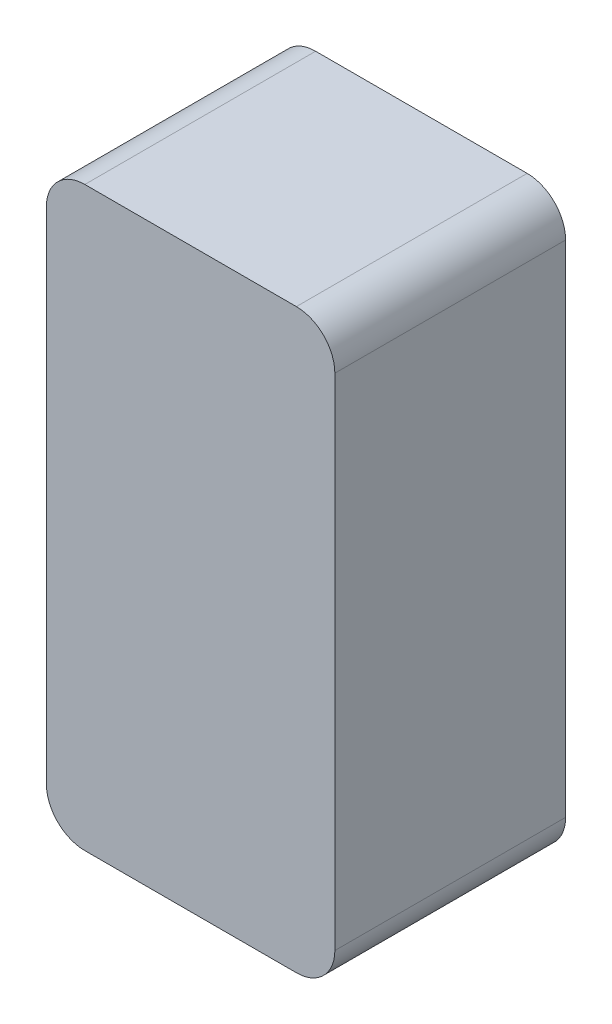
ISO-10303-21;
HEADER;
FILE_DESCRIPTION(('STEP AP214'),'2;1');
FILE_NAME('part.step','',(''),(''),'','','');
FILE_SCHEMA(('AUTOMOTIVE_DESIGN { 1 0 10303 214 1 1 1 1 }'));
ENDSEC;
DATA;
#1=APPLICATION_CONTEXT('core data for automotive mechanical design processes');
#2=APPLICATION_PROTOCOL_DEFINITION('international standard','automotive_design',2000,#1);
#3=PRODUCT_CONTEXT('',#1,'mechanical');
#4=PRODUCT('Part','Part','',(#3));
#5=PRODUCT_RELATED_PRODUCT_CATEGORY('part','',(#4));
#6=PRODUCT_DEFINITION_FORMATION('','',#4);
#7=PRODUCT_DEFINITION_CONTEXT('part definition',#1,'design');
#8=PRODUCT_DEFINITION('design','',#6,#7);
#9=PRODUCT_DEFINITION_SHAPE('','',#8);
#10=(LENGTH_UNIT() NAMED_UNIT(*) SI_UNIT(.MILLI.,.METRE.));
#11=(NAMED_UNIT(*) PLANE_ANGLE_UNIT() SI_UNIT($,.RADIAN.));
#12=(NAMED_UNIT(*) SI_UNIT($,.STERADIAN.) SOLID_ANGLE_UNIT());
#13=UNCERTAINTY_MEASURE_WITH_UNIT(LENGTH_MEASURE(1.E-05),#10,'distance_accuracy_value','');
#14=(GEOMETRIC_REPRESENTATION_CONTEXT(3) GLOBAL_UNCERTAINTY_ASSIGNED_CONTEXT((#13)) GLOBAL_UNIT_ASSIGNED_CONTEXT((#10,
#11,#12)) REPRESENTATION_CONTEXT('',''));
#15=CARTESIAN_POINT('',(0.,0.,0.));
#16=DIRECTION('',(0.,0.,1.));
#17=DIRECTION('',(1.,0.,0.));
#18=AXIS2_PLACEMENT_3D('',#15,#16,#17);
#19=CARTESIAN_POINT('',(-7.5,-15.,0.));
#20=DIRECTION('',(0.,0.,1.));
#21=DIRECTION('',(1.,0.,0.));
#22=AXIS2_PLACEMENT_3D('',#19,#20,#21);
#23=PLANE('',#22);
#24=DIRECTION('',(1.,0.,0.));
#25=VECTOR('',#24,1.);
#26=CARTESIAN_POINT('',(-7.5,-15.,0.));
#27=LINE('',#26,#25);
#28=CARTESIAN_POINT('',(-5.5,-15.,0.));
#29=VERTEX_POINT('',#28);
#30=CARTESIAN_POINT('',(5.5,-15.,0.));
#31=VERTEX_POINT('',#30);
#32=EDGE_CURVE('E166',#29,#31,#27,.T.);
#33=ORIENTED_EDGE('',*,*,#32,.F.);
#34=CARTESIAN_POINT('',(-5.5,-13.,0.));
#35=DIRECTION('',(0.,0.,1.));
#36=DIRECTION('',(1.,0.,0.));
#37=AXIS2_PLACEMENT_3D('',#34,#35,#36);
#38=CIRCLE('',#37,2.);
#39=CARTESIAN_POINT('',(-7.5,-13.,0.));
#40=VERTEX_POINT('',#39);
#41=EDGE_CURVE('E190',#29,#40,#38,.F.);
#42=ORIENTED_EDGE('',*,*,#41,.T.);
#43=DIRECTION('',(0.,-1.,0.));
#44=VECTOR('',#43,1.);
#45=CARTESIAN_POINT('',(-7.5,15.,0.));
#46=LINE('',#45,#44);
#47=CARTESIAN_POINT('',(-7.5,13.,0.));
#48=VERTEX_POINT('',#47);
#49=EDGE_CURVE('E163',#48,#40,#46,.T.);
#50=ORIENTED_EDGE('',*,*,#49,.F.);
#51=CARTESIAN_POINT('',(-5.5,13.,0.));
#52=DIRECTION('',(0.,0.,1.));
#53=DIRECTION('',(1.,0.,0.));
#54=AXIS2_PLACEMENT_3D('',#51,#52,#53);
#55=CIRCLE('',#54,2.);
#56=CARTESIAN_POINT('',(-5.5,15.,0.));
#57=VERTEX_POINT('',#56);
#58=EDGE_CURVE('E186',#48,#57,#55,.F.);
#59=ORIENTED_EDGE('',*,*,#58,.T.);
#60=DIRECTION('',(-1.,0.,0.));
#61=VECTOR('',#60,1.);
#62=CARTESIAN_POINT('',(-7.5,15.,0.));
#63=LINE('',#62,#61);
#64=CARTESIAN_POINT('',(5.5,15.,0.));
#65=VERTEX_POINT('',#64);
#66=EDGE_CURVE('E172',#65,#57,#63,.T.);
#67=ORIENTED_EDGE('',*,*,#66,.F.);
#68=CARTESIAN_POINT('',(5.5,13.,0.));
#69=DIRECTION('',(0.,0.,1.));
#70=DIRECTION('',(1.,0.,0.));
#71=AXIS2_PLACEMENT_3D('',#68,#69,#70);
#72=CIRCLE('',#71,2.);
#73=CARTESIAN_POINT('',(7.5,13.,0.));
#74=VERTEX_POINT('',#73);
#75=EDGE_CURVE('E184',#65,#74,#72,.F.);
#76=ORIENTED_EDGE('',*,*,#75,.T.);
#77=DIRECTION('',(0.,1.,0.));
#78=VECTOR('',#77,1.);
#79=CARTESIAN_POINT('',(7.5,15.,0.));
#80=LINE('',#79,#78);
#81=CARTESIAN_POINT('',(7.5,-13.,0.));
#82=VERTEX_POINT('',#81);
#83=EDGE_CURVE('E169',#82,#74,#80,.T.);
#84=ORIENTED_EDGE('',*,*,#83,.F.);
#85=CARTESIAN_POINT('',(5.5,-13.,0.));
#86=DIRECTION('',(0.,0.,1.));
#87=DIRECTION('',(1.,0.,0.));
#88=AXIS2_PLACEMENT_3D('',#85,#86,#87);
#89=CIRCLE('',#88,2.);
#90=EDGE_CURVE('E188',#82,#31,#89,.F.);
#91=ORIENTED_EDGE('',*,*,#90,.T.);
#92=EDGE_LOOP('',(#33,#42,#50,#59,#67,#76,#84,#91));
#93=FACE_BOUND('',#92,.T.);
#94=DIRECTION('',(0.,-1.,0.));
#95=VECTOR('',#94,1.);
#96=CARTESIAN_POINT('',(-6.,13.5,0.));
#97=LINE('',#96,#95);
#98=CARTESIAN_POINT('',(-6.,13.5,0.));
#99=VERTEX_POINT('',#98);
#100=CARTESIAN_POINT('',(-6.,-13.5,0.));
#101=VERTEX_POINT('',#100);
#102=EDGE_CURVE('E148',#99,#101,#97,.T.);
#103=ORIENTED_EDGE('',*,*,#102,.T.);
#104=DIRECTION('',(1.,0.,0.));
#105=VECTOR('',#104,1.);
#106=CARTESIAN_POINT('',(-6.,-13.5,0.));
#107=LINE('',#106,#105);
#108=CARTESIAN_POINT('',(6.,-13.5,0.));
#109=VERTEX_POINT('',#108);
#110=EDGE_CURVE('E151',#101,#109,#107,.T.);
#111=ORIENTED_EDGE('',*,*,#110,.T.);
#112=DIRECTION('',(0.,1.,0.));
#113=VECTOR('',#112,1.);
#114=CARTESIAN_POINT('',(6.,13.5,0.));
#115=LINE('',#114,#113);
#116=CARTESIAN_POINT('',(6.,13.5,0.));
#117=VERTEX_POINT('',#116);
#118=EDGE_CURVE('E155',#109,#117,#115,.T.);
#119=ORIENTED_EDGE('',*,*,#118,.T.);
#120=DIRECTION('',(-1.,0.,0.));
#121=VECTOR('',#120,1.);
#122=CARTESIAN_POINT('',(-6.,13.5,0.));
#123=LINE('',#122,#121);
#124=EDGE_CURVE('E135',#117,#99,#123,.T.);
#125=ORIENTED_EDGE('',*,*,#124,.T.);
#126=EDGE_LOOP('',(#103,#111,#119,#125));
#127=FACE_BOUND('',#126,.T.);
#128=ADVANCED_FACE('F30',(#93,#127),#23,.F.);
#129=CARTESIAN_POINT('',(-7.5,15.,10.));
#130=DIRECTION('',(1.,0.,0.));
#131=DIRECTION('',(0.,0.,-1.));
#132=AXIS2_PLACEMENT_3D('',#129,#130,#131);
#133=PLANE('',#132);
#134=ORIENTED_EDGE('',*,*,#49,.T.);
#135=DIRECTION('',(0.,0.,-1.));
#136=VECTOR('',#135,1.);
#137=CARTESIAN_POINT('',(-7.5,-13.,10.));
#138=LINE('',#137,#136);
#139=CARTESIAN_POINT('',(-7.5,-13.,12.));
#140=VERTEX_POINT('',#139);
#141=EDGE_CURVE('E195',#40,#140,#138,.F.);
#142=ORIENTED_EDGE('',*,*,#141,.T.);
#143=DIRECTION('',(0.,-1.,0.));
#144=VECTOR('',#143,1.);
#145=CARTESIAN_POINT('',(-7.5,30.1327459504216,12.));
#146=LINE('',#145,#144);
#147=CARTESIAN_POINT('',(-7.5,13.,12.));
#148=VERTEX_POINT('',#147);
#149=EDGE_CURVE('E227',#148,#140,#146,.T.);
#150=ORIENTED_EDGE('',*,*,#149,.F.);
#151=DIRECTION('',(0.,0.,-1.));
#152=VECTOR('',#151,1.);
#153=CARTESIAN_POINT('',(-7.5,13.,10.));
#154=LINE('',#153,#152);
#155=EDGE_CURVE('E192',#148,#48,#154,.T.);
#156=ORIENTED_EDGE('',*,*,#155,.T.);
#157=EDGE_LOOP('',(#134,#142,#150,#156));
#158=FACE_BOUND('',#157,.T.);
#159=ADVANCED_FACE('F224',(#158),#133,.F.);
#160=CARTESIAN_POINT('',(-7.5,-15.,10.));
#161=DIRECTION('',(0.,1.,0.));
#162=DIRECTION('',(0.,0.,1.));
#163=AXIS2_PLACEMENT_3D('',#160,#161,#162);
#164=PLANE('',#163);
#165=CARTESIAN_POINT('',(0.,-15.,5.));
#166=DIRECTION('',(0.,-1.,0.));
#167=DIRECTION('',(0.,0.,-1.));
#168=AXIS2_PLACEMENT_3D('',#165,#166,#167);
#169=CIRCLE('',#168,4.953);
#170=CARTESIAN_POINT('',(0.,-15.,0.0469999999999993));
#171=VERTEX_POINT('',#170);
#172=EDGE_CURVE('E179',#171,#171,#169,.T.);
#173=ORIENTED_EDGE('',*,*,#172,.F.);
#174=EDGE_LOOP('',(#173));
#175=FACE_BOUND('',#174,.T.);
#176=DIRECTION('',(-1.,0.,0.));
#177=VECTOR('',#176,1.);
#178=CARTESIAN_POINT('',(-7.5,-15.,12.));
#179=LINE('',#178,#177);
#180=CARTESIAN_POINT('',(5.5,-15.,12.));
#181=VERTEX_POINT('',#180);
#182=CARTESIAN_POINT('',(-5.5,-15.,12.));
#183=VERTEX_POINT('',#182);
#184=EDGE_CURVE('E178',#181,#183,#179,.T.);
#185=ORIENTED_EDGE('',*,*,#184,.T.);
#186=DIRECTION('',(0.,0.,-1.));
#187=VECTOR('',#186,1.);
#188=CARTESIAN_POINT('',(-5.5,-15.,10.));
#189=LINE('',#188,#187);
#190=EDGE_CURVE('E181',#183,#29,#189,.T.);
#191=ORIENTED_EDGE('',*,*,#190,.T.);
#192=ORIENTED_EDGE('',*,*,#32,.T.);
#193=DIRECTION('',(0.,0.,-1.));
#194=VECTOR('',#193,1.);
#195=CARTESIAN_POINT('',(5.5,-15.,10.));
#196=LINE('',#195,#194);
#197=EDGE_CURVE('E174',#31,#181,#196,.F.);
#198=ORIENTED_EDGE('',*,*,#197,.T.);
#199=EDGE_LOOP('',(#185,#191,#192,#198));
#200=FACE_BOUND('',#199,.T.);
#201=ADVANCED_FACE('F244',(#175,#200),#164,.F.);
#202=CARTESIAN_POINT('',(7.5,15.,10.));
#203=DIRECTION('',(-1.,0.,0.));
#204=DIRECTION('',(0.,0.,1.));
#205=AXIS2_PLACEMENT_3D('',#202,#203,#204);
#206=PLANE('',#205);
#207=DIRECTION('',(0.,-1.,0.));
#208=VECTOR('',#207,1.);
#209=CARTESIAN_POINT('',(7.5,30.1327459504216,12.));
#210=LINE('',#209,#208);
#211=CARTESIAN_POINT('',(7.5,13.,12.));
#212=VERTEX_POINT('',#211);
#213=CARTESIAN_POINT('',(7.5,-13.,12.));
#214=VERTEX_POINT('',#213);
#215=EDGE_CURVE('E229',#212,#214,#210,.T.);
#216=ORIENTED_EDGE('',*,*,#215,.T.);
#217=DIRECTION('',(0.,0.,-1.));
#218=VECTOR('',#217,1.);
#219=CARTESIAN_POINT('',(7.5,-13.,10.));
#220=LINE('',#219,#218);
#221=EDGE_CURVE('E206',#214,#82,#220,.T.);
#222=ORIENTED_EDGE('',*,*,#221,.T.);
#223=ORIENTED_EDGE('',*,*,#83,.T.);
#224=DIRECTION('',(0.,0.,-1.));
#225=VECTOR('',#224,1.);
#226=CARTESIAN_POINT('',(7.5,13.,10.));
#227=LINE('',#226,#225);
#228=EDGE_CURVE('E204',#74,#212,#227,.F.);
#229=ORIENTED_EDGE('',*,*,#228,.T.);
#230=EDGE_LOOP('',(#216,#222,#223,#229));
#231=FACE_BOUND('',#230,.T.);
#232=ADVANCED_FACE('F251',(#231),#206,.F.);
#233=CARTESIAN_POINT('',(-7.5,15.,10.));
#234=DIRECTION('',(0.,-1.,0.));
#235=DIRECTION('',(0.,0.,-1.));
#236=AXIS2_PLACEMENT_3D('',#233,#234,#235);
#237=PLANE('',#236);
#238=ORIENTED_EDGE('',*,*,#66,.T.);
#239=DIRECTION('',(0.,0.,-1.));
#240=VECTOR('',#239,1.);
#241=CARTESIAN_POINT('',(-5.5,15.,10.));
#242=LINE('',#241,#240);
#243=CARTESIAN_POINT('',(-5.5,15.,12.));
#244=VERTEX_POINT('',#243);
#245=EDGE_CURVE('E11',#57,#244,#242,.F.);
#246=ORIENTED_EDGE('',*,*,#245,.T.);
#247=DIRECTION('',(-1.,0.,0.));
#248=VECTOR('',#247,1.);
#249=CARTESIAN_POINT('',(-7.5,15.,12.));
#250=LINE('',#249,#248);
#251=CARTESIAN_POINT('',(5.5,15.,12.));
#252=VERTEX_POINT('',#251);
#253=EDGE_CURVE('E152',#252,#244,#250,.T.);
#254=ORIENTED_EDGE('',*,*,#253,.F.);
#255=DIRECTION('',(0.,0.,-1.));
#256=VECTOR('',#255,1.);
#257=CARTESIAN_POINT('',(5.5,15.,10.));
#258=LINE('',#257,#256);
#259=EDGE_CURVE('E38',#252,#65,#258,.T.);
#260=ORIENTED_EDGE('',*,*,#259,.T.);
#261=EDGE_LOOP('',(#238,#246,#254,#260));
#262=FACE_BOUND('',#261,.T.);
#263=ADVANCED_FACE('F211',(#262),#237,.F.);
#264=CARTESIAN_POINT('',(-6.,13.5,10.));
#265=DIRECTION('',(1.,0.,0.));
#266=DIRECTION('',(0.,1.,0.));
#267=AXIS2_PLACEMENT_3D('',#264,#265,#266);
#268=PLANE('',#267);
#269=ORIENTED_EDGE('',*,*,#102,.F.);
#270=DIRECTION('',(0.,0.,-1.));
#271=VECTOR('',#270,1.);
#272=CARTESIAN_POINT('',(-6.,13.5,10.));
#273=LINE('',#272,#271);
#274=CARTESIAN_POINT('',(-6.,13.5,10.));
#275=VERTEX_POINT('',#274);
#276=EDGE_CURVE('E129',#275,#99,#273,.T.);
#277=ORIENTED_EDGE('',*,*,#276,.F.);
#278=DIRECTION('',(0.,-1.,0.));
#279=VECTOR('',#278,1.);
#280=CARTESIAN_POINT('',(-6.,13.5,10.));
#281=LINE('',#280,#279);
#282=CARTESIAN_POINT('',(-6.,-13.5,10.));
#283=VERTEX_POINT('',#282);
#284=EDGE_CURVE('E125',#275,#283,#281,.T.);
#285=ORIENTED_EDGE('',*,*,#284,.T.);
#286=DIRECTION('',(0.,0.,-1.));
#287=VECTOR('',#286,1.);
#288=CARTESIAN_POINT('',(-6.,-13.5,10.));
#289=LINE('',#288,#287);
#290=EDGE_CURVE('E160',#283,#101,#289,.T.);
#291=ORIENTED_EDGE('',*,*,#290,.T.);
#292=EDGE_LOOP('',(#269,#277,#285,#291));
#293=FACE_BOUND('',#292,.T.);
#294=ADVANCED_FACE('F236',(#293),#268,.T.);
#295=CARTESIAN_POINT('',(-6.,-13.5,10.));
#296=DIRECTION('',(0.,1.,0.));
#297=DIRECTION('',(0.,0.,1.));
#298=AXIS2_PLACEMENT_3D('',#295,#296,#297);
#299=PLANE('',#298);
#300=CARTESIAN_POINT('',(0.,-13.5,5.));
#301=DIRECTION('',(0.,1.,0.));
#302=DIRECTION('',(0.,0.,1.));
#303=AXIS2_PLACEMENT_3D('',#300,#301,#302);
#304=CIRCLE('',#303,4.953);
#305=CARTESIAN_POINT('',(0.,-13.5,9.953));
#306=VERTEX_POINT('',#305);
#307=EDGE_CURVE('E175',#306,#306,#304,.T.);
#308=ORIENTED_EDGE('',*,*,#307,.F.);
#309=EDGE_LOOP('',(#308));
#310=FACE_BOUND('',#309,.T.);
#311=ORIENTED_EDGE('',*,*,#110,.F.);
#312=ORIENTED_EDGE('',*,*,#290,.F.);
#313=DIRECTION('',(1.,0.,0.));
#314=VECTOR('',#313,1.);
#315=CARTESIAN_POINT('',(-6.,-13.5,10.));
#316=LINE('',#315,#314);
#317=CARTESIAN_POINT('',(6.,-13.5,10.));
#318=VERTEX_POINT('',#317);
#319=EDGE_CURVE('E143',#283,#318,#316,.T.);
#320=ORIENTED_EDGE('',*,*,#319,.T.);
#321=DIRECTION('',(0.,0.,-1.));
#322=VECTOR('',#321,1.);
#323=CARTESIAN_POINT('',(6.,-13.5,10.));
#324=LINE('',#323,#322);
#325=EDGE_CURVE('E139',#318,#109,#324,.T.);
#326=ORIENTED_EDGE('',*,*,#325,.T.);
#327=EDGE_LOOP('',(#311,#312,#320,#326));
#328=FACE_BOUND('',#327,.T.);
#329=ADVANCED_FACE('F238',(#310,#328),#299,.T.);
#330=CARTESIAN_POINT('',(6.,13.5,10.));
#331=DIRECTION('',(-1.,0.,0.));
#332=DIRECTION('',(0.,-1.,0.));
#333=AXIS2_PLACEMENT_3D('',#330,#331,#332);
#334=PLANE('',#333);
#335=ORIENTED_EDGE('',*,*,#118,.F.);
#336=ORIENTED_EDGE('',*,*,#325,.F.);
#337=DIRECTION('',(0.,1.,0.));
#338=VECTOR('',#337,1.);
#339=CARTESIAN_POINT('',(6.,13.5,10.));
#340=LINE('',#339,#338);
#341=CARTESIAN_POINT('',(6.,13.5,10.));
#342=VERTEX_POINT('',#341);
#343=EDGE_CURVE('E122',#318,#342,#340,.T.);
#344=ORIENTED_EDGE('',*,*,#343,.T.);
#345=DIRECTION('',(0.,0.,-1.));
#346=VECTOR('',#345,1.);
#347=CARTESIAN_POINT('',(6.,13.5,10.));
#348=LINE('',#347,#346);
#349=EDGE_CURVE('E132',#342,#117,#348,.T.);
#350=ORIENTED_EDGE('',*,*,#349,.T.);
#351=EDGE_LOOP('',(#335,#336,#344,#350));
#352=FACE_BOUND('',#351,.T.);
#353=ADVANCED_FACE('F142',(#352),#334,.T.);
#354=CARTESIAN_POINT('',(-6.,13.5,10.));
#355=DIRECTION('',(0.,-1.,0.));
#356=DIRECTION('',(0.,0.,-1.));
#357=AXIS2_PLACEMENT_3D('',#354,#355,#356);
#358=PLANE('',#357);
#359=ORIENTED_EDGE('',*,*,#124,.F.);
#360=ORIENTED_EDGE('',*,*,#349,.F.);
#361=DIRECTION('',(-1.,0.,0.));
#362=VECTOR('',#361,1.);
#363=CARTESIAN_POINT('',(-6.,13.5,10.));
#364=LINE('',#363,#362);
#365=EDGE_CURVE('E118',#342,#275,#364,.T.);
#366=ORIENTED_EDGE('',*,*,#365,.T.);
#367=ORIENTED_EDGE('',*,*,#276,.T.);
#368=EDGE_LOOP('',(#359,#360,#366,#367));
#369=FACE_BOUND('',#368,.T.);
#370=ADVANCED_FACE('F133',(#369),#358,.T.);
#371=CARTESIAN_POINT('',(-7.5,30.1327459504216,10.));
#372=DIRECTION('',(0.,0.,1.));
#373=DIRECTION('',(1.,0.,0.));
#374=AXIS2_PLACEMENT_3D('',#371,#372,#373);
#375=PLANE('',#374);
#376=ORIENTED_EDGE('',*,*,#284,.F.);
#377=ORIENTED_EDGE('',*,*,#365,.F.);
#378=ORIENTED_EDGE('',*,*,#343,.F.);
#379=ORIENTED_EDGE('',*,*,#319,.F.);
#380=EDGE_LOOP('',(#376,#377,#378,#379));
#381=FACE_BOUND('',#380,.T.);
#382=ADVANCED_FACE('F120',(#381),#375,.F.);
#383=CARTESIAN_POINT('',(-7.5,30.1327459504216,12.));
#384=DIRECTION('',(0.,0.,-1.));
#385=DIRECTION('',(-1.,0.,0.));
#386=AXIS2_PLACEMENT_3D('',#383,#384,#385);
#387=PLANE('',#386);
#388=ORIENTED_EDGE('',*,*,#149,.T.);
#389=CARTESIAN_POINT('',(-5.5,-13.,12.));
#390=DIRECTION('',(0.,0.,-1.));
#391=DIRECTION('',(-1.,0.,0.));
#392=AXIS2_PLACEMENT_3D('',#389,#390,#391);
#393=CIRCLE('',#392,2.);
#394=EDGE_CURVE('E202',#140,#183,#393,.F.);
#395=ORIENTED_EDGE('',*,*,#394,.T.);
#396=ORIENTED_EDGE('',*,*,#184,.F.);
#397=CARTESIAN_POINT('',(5.5,-13.,12.));
#398=DIRECTION('',(0.,0.,-1.));
#399=DIRECTION('',(-1.,0.,0.));
#400=AXIS2_PLACEMENT_3D('',#397,#398,#399);
#401=CIRCLE('',#400,2.);
#402=EDGE_CURVE('E200',#181,#214,#401,.F.);
#403=ORIENTED_EDGE('',*,*,#402,.T.);
#404=ORIENTED_EDGE('',*,*,#215,.F.);
#405=CARTESIAN_POINT('',(5.5,13.,12.));
#406=DIRECTION('',(0.,0.,-1.));
#407=DIRECTION('',(-1.,0.,0.));
#408=AXIS2_PLACEMENT_3D('',#405,#406,#407);
#409=CIRCLE('',#408,2.);
#410=EDGE_CURVE('E50',#212,#252,#409,.F.);
#411=ORIENTED_EDGE('',*,*,#410,.T.);
#412=ORIENTED_EDGE('',*,*,#253,.T.);
#413=CARTESIAN_POINT('',(-5.5,13.,12.));
#414=DIRECTION('',(0.,0.,-1.));
#415=DIRECTION('',(-1.,0.,0.));
#416=AXIS2_PLACEMENT_3D('',#413,#414,#415);
#417=CIRCLE('',#416,2.);
#418=EDGE_CURVE('E198',#244,#148,#417,.F.);
#419=ORIENTED_EDGE('',*,*,#418,.T.);
#420=EDGE_LOOP('',(#388,#395,#396,#403,#404,#411,#412,#419));
#421=FACE_BOUND('',#420,.T.);
#422=ADVANCED_FACE('F274',(#421),#387,.F.);
#423=CARTESIAN_POINT('',(0.,-5.,5.));
#424=DIRECTION('',(0.,-1.,0.));
#425=DIRECTION('',(0.,0.,-1.));
#426=AXIS2_PLACEMENT_3D('',#423,#424,#425);
#427=CYLINDRICAL_SURFACE('',#426,4.953);
#428=ORIENTED_EDGE('',*,*,#307,.T.);
#429=EDGE_LOOP('',(#428));
#430=FACE_BOUND('',#429,.T.);
#431=ORIENTED_EDGE('',*,*,#172,.T.);
#432=EDGE_LOOP('',(#431));
#433=FACE_BOUND('',#432,.T.);
#434=ADVANCED_FACE('F262',(#430,#433),#427,.F.);
#435=CARTESIAN_POINT('',(-5.5,-13.,10.));
#436=DIRECTION('',(0.,0.,-1.));
#437=DIRECTION('',(-1.,0.,0.));
#438=AXIS2_PLACEMENT_3D('',#435,#436,#437);
#439=CYLINDRICAL_SURFACE('',#438,2.);
#440=ORIENTED_EDGE('',*,*,#394,.F.);
#441=ORIENTED_EDGE('',*,*,#141,.F.);
#442=ORIENTED_EDGE('',*,*,#41,.F.);
#443=ORIENTED_EDGE('',*,*,#190,.F.);
#444=EDGE_LOOP('',(#440,#441,#442,#443));
#445=FACE_BOUND('',#444,.T.);
#446=ADVANCED_FACE('F258',(#445),#439,.T.);
#447=CARTESIAN_POINT('',(5.5,-13.,10.));
#448=DIRECTION('',(0.,0.,-1.));
#449=DIRECTION('',(-1.,0.,0.));
#450=AXIS2_PLACEMENT_3D('',#447,#448,#449);
#451=CYLINDRICAL_SURFACE('',#450,2.);
#452=ORIENTED_EDGE('',*,*,#402,.F.);
#453=ORIENTED_EDGE('',*,*,#197,.F.);
#454=ORIENTED_EDGE('',*,*,#90,.F.);
#455=ORIENTED_EDGE('',*,*,#221,.F.);
#456=EDGE_LOOP('',(#452,#453,#454,#455));
#457=FACE_BOUND('',#456,.T.);
#458=ADVANCED_FACE('F261',(#457),#451,.T.);
#459=CARTESIAN_POINT('',(-5.5,13.,10.));
#460=DIRECTION('',(0.,0.,-1.));
#461=DIRECTION('',(-1.,0.,0.));
#462=AXIS2_PLACEMENT_3D('',#459,#460,#461);
#463=CYLINDRICAL_SURFACE('',#462,2.);
#464=ORIENTED_EDGE('',*,*,#418,.F.);
#465=ORIENTED_EDGE('',*,*,#245,.F.);
#466=ORIENTED_EDGE('',*,*,#58,.F.);
#467=ORIENTED_EDGE('',*,*,#155,.F.);
#468=EDGE_LOOP('',(#464,#465,#466,#467));
#469=FACE_BOUND('',#468,.T.);
#470=ADVANCED_FACE('F221',(#469),#463,.T.);
#471=CARTESIAN_POINT('',(5.5,13.,10.));
#472=DIRECTION('',(0.,0.,-1.));
#473=DIRECTION('',(-1.,0.,0.));
#474=AXIS2_PLACEMENT_3D('',#471,#472,#473);
#475=CYLINDRICAL_SURFACE('',#474,2.);
#476=ORIENTED_EDGE('',*,*,#410,.F.);
#477=ORIENTED_EDGE('',*,*,#228,.F.);
#478=ORIENTED_EDGE('',*,*,#75,.F.);
#479=ORIENTED_EDGE('',*,*,#259,.F.);
#480=EDGE_LOOP('',(#476,#477,#478,#479));
#481=FACE_BOUND('',#480,.T.);
#482=ADVANCED_FACE('F32',(#481),#475,.T.);
#483=CLOSED_SHELL('',(#128,#159,#201,#232,#263,#294,#329,#353,#370,#382,#422,#434,#446,#458,
#470,#482));
#484=MANIFOLD_SOLID_BREP('B2',#483);
#485=ADVANCED_BREP_SHAPE_REPRESENTATION('',(#18,#484),#14);
#486=SHAPE_DEFINITION_REPRESENTATION(#9,#485);
ENDSEC;
END-ISO-10303-21;
